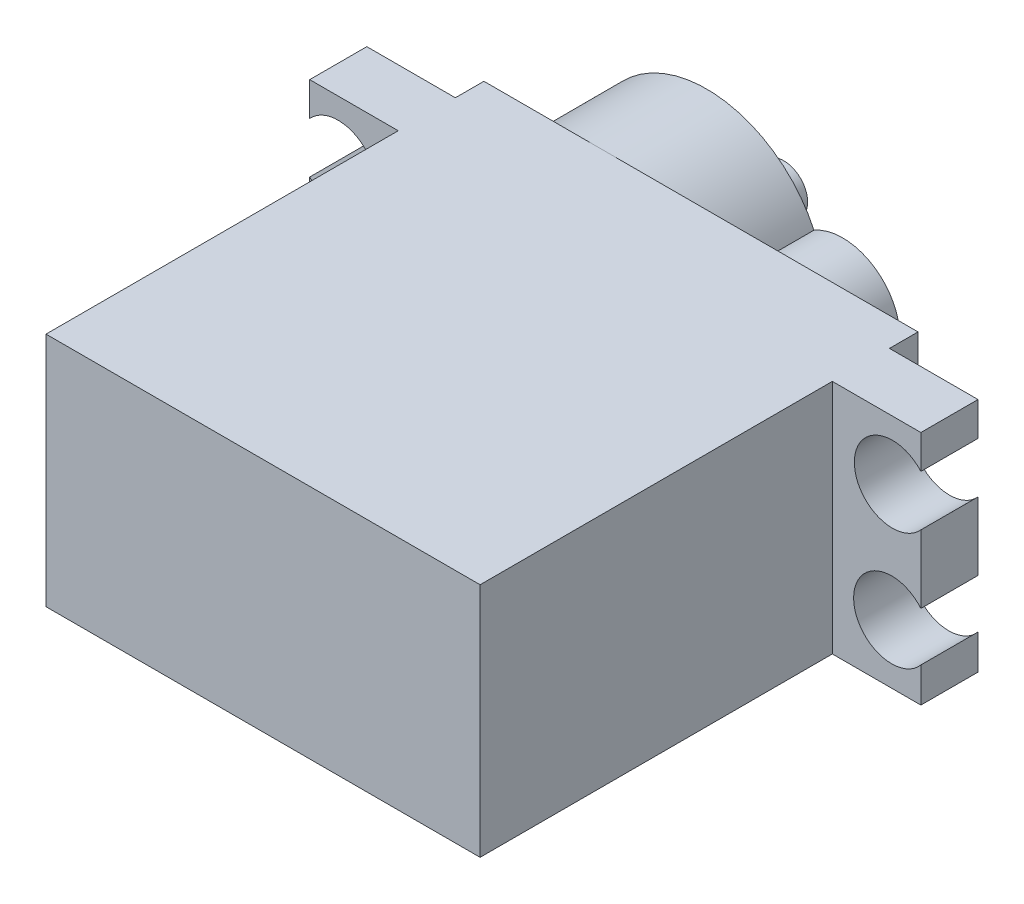
ISO-10303-21;
HEADER;
FILE_DESCRIPTION(('STEP AP214'),'2;1');
FILE_NAME('part.step','',(''),(''),'','','');
FILE_SCHEMA(('AUTOMOTIVE_DESIGN { 1 0 10303 214 1 1 1 1 }'));
ENDSEC;
DATA;
#1=APPLICATION_CONTEXT('core data for automotive mechanical design processes');
#2=APPLICATION_PROTOCOL_DEFINITION('international standard','automotive_design',2000,#1);
#3=PRODUCT_CONTEXT('',#1,'mechanical');
#4=PRODUCT('Part','Part','',(#3));
#5=PRODUCT_RELATED_PRODUCT_CATEGORY('part','',(#4));
#6=PRODUCT_DEFINITION_FORMATION('','',#4);
#7=PRODUCT_DEFINITION_CONTEXT('part definition',#1,'design');
#8=PRODUCT_DEFINITION('design','',#6,#7);
#9=PRODUCT_DEFINITION_SHAPE('','',#8);
#10=(LENGTH_UNIT() NAMED_UNIT(*) SI_UNIT(.MILLI.,.METRE.));
#11=(NAMED_UNIT(*) PLANE_ANGLE_UNIT() SI_UNIT($,.RADIAN.));
#12=(NAMED_UNIT(*) SI_UNIT($,.STERADIAN.) SOLID_ANGLE_UNIT());
#13=UNCERTAINTY_MEASURE_WITH_UNIT(LENGTH_MEASURE(1.E-05),#10,'distance_accuracy_value','');
#14=(GEOMETRIC_REPRESENTATION_CONTEXT(3) GLOBAL_UNCERTAINTY_ASSIGNED_CONTEXT((#13)) GLOBAL_UNIT_ASSIGNED_CONTEXT((#10,
#11,#12)) REPRESENTATION_CONTEXT('',''));
#15=CARTESIAN_POINT('',(0.,0.,0.));
#16=DIRECTION('',(0.,0.,1.));
#17=DIRECTION('',(1.,0.,0.));
#18=AXIS2_PLACEMENT_3D('',#15,#16,#17);
#19=CARTESIAN_POINT('',(0.,0.,-2.5));
#20=DIRECTION('',(-1.,0.,0.));
#21=DIRECTION('',(0.,0.,1.));
#22=AXIS2_PLACEMENT_3D('',#19,#20,#21);
#23=PLANE('',#22);
#24=DIRECTION('',(0.,-1.,0.));
#25=VECTOR('',#24,1.);
#26=CARTESIAN_POINT('',(0.,0.,-3.));
#27=LINE('',#26,#25);
#28=CARTESIAN_POINT('',(0.,7.97069275906132,-3.));
#29=VERTEX_POINT('',#28);
#30=CARTESIAN_POINT('',(0.,4.42930724093868,-3.));
#31=VERTEX_POINT('',#30);
#32=EDGE_CURVE('E215',#29,#31,#27,.T.);
#33=ORIENTED_EDGE('',*,*,#32,.T.);
#34=DIRECTION('',(0.,0.,-1.));
#35=VECTOR('',#34,1.);
#36=CARTESIAN_POINT('',(0.,4.42930724093868,18.501));
#37=LINE('',#36,#35);
#38=CARTESIAN_POINT('',(0.,4.42930724093868,0.));
#39=VERTEX_POINT('',#38);
#40=EDGE_CURVE('E60',#39,#31,#37,.T.);
#41=ORIENTED_EDGE('',*,*,#40,.F.);
#42=DIRECTION('',(0.,-1.,0.));
#43=VECTOR('',#42,1.);
#44=CARTESIAN_POINT('',(0.,0.,0.));
#45=LINE('',#44,#43);
#46=CARTESIAN_POINT('',(0.,7.97069275906132,0.));
#47=VERTEX_POINT('',#46);
#48=EDGE_CURVE('E217',#47,#39,#45,.T.);
#49=ORIENTED_EDGE('',*,*,#48,.F.);
#50=DIRECTION('',(0.,0.,-1.));
#51=VECTOR('',#50,1.);
#52=CARTESIAN_POINT('',(0.,7.97069275906132,18.501));
#53=LINE('',#52,#51);
#54=EDGE_CURVE('E203',#47,#29,#53,.T.);
#55=ORIENTED_EDGE('',*,*,#54,.T.);
#56=EDGE_LOOP('',(#33,#41,#49,#55));
#57=FACE_BOUND('',#56,.T.);
#58=ADVANCED_FACE('F41',(#57),#23,.T.);
#59=CARTESIAN_POINT('',(0.,1.77069275906132,0.));
#60=VERTEX_POINT('',#59);
#61=CARTESIAN_POINT('',(0.,0.,0.));
#62=VERTEX_POINT('',#61);
#63=EDGE_CURVE('E245',#60,#62,#45,.T.);
#64=ORIENTED_EDGE('',*,*,#63,.F.);
#65=DIRECTION('',(0.,0.,-1.));
#66=VECTOR('',#65,1.);
#67=CARTESIAN_POINT('',(0.,1.77069275906132,18.501));
#68=LINE('',#67,#66);
#69=CARTESIAN_POINT('',(0.,1.77069275906132,-3.));
#70=VERTEX_POINT('',#69);
#71=EDGE_CURVE('E459',#60,#70,#68,.T.);
#72=ORIENTED_EDGE('',*,*,#71,.T.);
#73=CARTESIAN_POINT('',(0.,0.,-3.));
#74=VERTEX_POINT('',#73);
#75=EDGE_CURVE('E226',#70,#74,#27,.T.);
#76=ORIENTED_EDGE('',*,*,#75,.T.);
#77=DIRECTION('',(0.,0.,1.));
#78=VECTOR('',#77,1.);
#79=CARTESIAN_POINT('',(0.,0.,-2.5));
#80=LINE('',#79,#78);
#81=EDGE_CURVE('E255',#74,#62,#80,.T.);
#82=ORIENTED_EDGE('',*,*,#81,.T.);
#83=EDGE_LOOP('',(#64,#72,#76,#82));
#84=FACE_BOUND('',#83,.T.);
#85=ADVANCED_FACE('F351',(#84),#23,.T.);
#86=DIRECTION('',(0.,0.,-1.));
#87=VECTOR('',#86,1.);
#88=CARTESIAN_POINT('',(0.,10.6293072409387,18.501));
#89=LINE('',#88,#87);
#90=CARTESIAN_POINT('',(0.,10.6293072409387,-3.));
#91=VERTEX_POINT('',#90);
#92=CARTESIAN_POINT('',(0.,10.6293072409387,0.));
#93=VERTEX_POINT('',#92);
#94=EDGE_CURVE('E68',#91,#93,#89,.F.);
#95=ORIENTED_EDGE('',*,*,#94,.T.);
#96=CARTESIAN_POINT('',(0.,12.4,0.));
#97=VERTEX_POINT('',#96);
#98=EDGE_CURVE('E246',#97,#93,#45,.T.);
#99=ORIENTED_EDGE('',*,*,#98,.F.);
#100=DIRECTION('',(0.,0.,1.));
#101=VECTOR('',#100,1.);
#102=CARTESIAN_POINT('',(0.,12.4,-2.5));
#103=LINE('',#102,#101);
#104=CARTESIAN_POINT('',(0.,12.4,-3.));
#105=VERTEX_POINT('',#104);
#106=EDGE_CURVE('E254',#105,#97,#103,.T.);
#107=ORIENTED_EDGE('',*,*,#106,.F.);
#108=EDGE_CURVE('E225',#105,#91,#27,.T.);
#109=ORIENTED_EDGE('',*,*,#108,.T.);
#110=EDGE_LOOP('',(#95,#99,#107,#109));
#111=FACE_BOUND('',#110,.T.);
#112=ADVANCED_FACE('F469',(#111),#23,.T.);
#113=CARTESIAN_POINT('',(0.,0.,0.));
#114=DIRECTION('',(0.,0.,1.));
#115=DIRECTION('',(1.,0.,0.));
#116=AXIS2_PLACEMENT_3D('',#113,#114,#115);
#117=PLANE('',#116);
#118=ORIENTED_EDGE('',*,*,#48,.T.);
#119=CARTESIAN_POINT('',(1.49430326881393,3.1,0.));
#120=DIRECTION('',(0.,0.,1.));
#121=DIRECTION('',(1.,0.,0.));
#122=AXIS2_PLACEMENT_3D('',#119,#120,#121);
#123=CIRCLE('',#122,2.);
#124=EDGE_CURVE('E348',#60,#39,#123,.T.);
#125=ORIENTED_EDGE('',*,*,#124,.F.);
#126=ORIENTED_EDGE('',*,*,#63,.T.);
#127=DIRECTION('',(1.,0.,0.));
#128=VECTOR('',#127,1.);
#129=CARTESIAN_POINT('',(0.,0.,0.));
#130=LINE('',#129,#128);
#131=CARTESIAN_POINT('',(4.65,0.,0.));
#132=VERTEX_POINT('',#131);
#133=EDGE_CURVE('E250',#62,#132,#130,.T.);
#134=ORIENTED_EDGE('',*,*,#133,.T.);
#135=DIRECTION('',(0.,-1.,0.));
#136=VECTOR('',#135,1.);
#137=CARTESIAN_POINT('',(4.65,0.,0.));
#138=LINE('',#137,#136);
#139=CARTESIAN_POINT('',(4.65,12.4,0.));
#140=VERTEX_POINT('',#139);
#141=EDGE_CURVE('E238',#140,#132,#138,.T.);
#142=ORIENTED_EDGE('',*,*,#141,.F.);
#143=DIRECTION('',(-1.,0.,0.));
#144=VECTOR('',#143,1.);
#145=CARTESIAN_POINT('',(0.,12.4,0.));
#146=LINE('',#145,#144);
#147=EDGE_CURVE('E241',#140,#97,#146,.T.);
#148=ORIENTED_EDGE('',*,*,#147,.T.);
#149=ORIENTED_EDGE('',*,*,#98,.T.);
#150=CARTESIAN_POINT('',(1.49430326881393,9.3,0.));
#151=DIRECTION('',(0.,0.,1.));
#152=DIRECTION('',(1.,0.,0.));
#153=AXIS2_PLACEMENT_3D('',#150,#151,#152);
#154=CIRCLE('',#153,2.);
#155=EDGE_CURVE('E210',#93,#47,#154,.F.);
#156=ORIENTED_EDGE('',*,*,#155,.T.);
#157=EDGE_LOOP('',(#118,#125,#126,#134,#142,#148,#149,#156));
#158=FACE_BOUND('',#157,.T.);
#159=ADVANCED_FACE('F346',(#158),#117,.T.);
#160=CARTESIAN_POINT('',(0.,0.,-3.));
#161=DIRECTION('',(0.,0.,1.));
#162=DIRECTION('',(1.,0.,0.));
#163=AXIS2_PLACEMENT_3D('',#160,#161,#162);
#164=PLANE('',#163);
#165=CARTESIAN_POINT('',(1.49430326881393,3.1,-3.));
#166=DIRECTION('',(0.,0.,-1.));
#167=DIRECTION('',(-1.,0.,0.));
#168=AXIS2_PLACEMENT_3D('',#165,#166,#167);
#169=CIRCLE('',#168,2.);
#170=EDGE_CURVE('E223',#70,#31,#169,.F.);
#171=ORIENTED_EDGE('',*,*,#170,.T.);
#172=ORIENTED_EDGE('',*,*,#32,.F.);
#173=CARTESIAN_POINT('',(1.49430326881393,9.3,-3.));
#174=DIRECTION('',(0.,0.,-1.));
#175=DIRECTION('',(-1.,0.,0.));
#176=AXIS2_PLACEMENT_3D('',#173,#174,#175);
#177=CIRCLE('',#176,2.);
#178=EDGE_CURVE('E200',#91,#29,#177,.T.);
#179=ORIENTED_EDGE('',*,*,#178,.F.);
#180=ORIENTED_EDGE('',*,*,#108,.F.);
#181=DIRECTION('',(-1.,0.,0.));
#182=VECTOR('',#181,1.);
#183=CARTESIAN_POINT('',(0.,12.4,-3.));
#184=LINE('',#183,#182);
#185=CARTESIAN_POINT('',(4.65,12.4,-3.));
#186=VERTEX_POINT('',#185);
#187=EDGE_CURVE('E231',#186,#105,#184,.T.);
#188=ORIENTED_EDGE('',*,*,#187,.F.);
#189=DIRECTION('',(0.,-1.,0.));
#190=VECTOR('',#189,1.);
#191=CARTESIAN_POINT('',(4.65,0.,-3.));
#192=LINE('',#191,#190);
#193=CARTESIAN_POINT('',(4.65,0.,-3.));
#194=VERTEX_POINT('',#193);
#195=EDGE_CURVE('E353',#186,#194,#192,.T.);
#196=ORIENTED_EDGE('',*,*,#195,.T.);
#197=DIRECTION('',(1.,0.,0.));
#198=VECTOR('',#197,1.);
#199=CARTESIAN_POINT('',(0.,0.,-3.));
#200=LINE('',#199,#198);
#201=EDGE_CURVE('E230',#74,#194,#200,.T.);
#202=ORIENTED_EDGE('',*,*,#201,.F.);
#203=ORIENTED_EDGE('',*,*,#75,.F.);
#204=EDGE_LOOP('',(#171,#172,#179,#180,#188,#196,#202,#203));
#205=FACE_BOUND('',#204,.T.);
#206=ADVANCED_FACE('F221',(#205),#164,.F.);
#207=CARTESIAN_POINT('',(32.1,0.,-2.5));
#208=DIRECTION('',(1.,0.,0.));
#209=DIRECTION('',(0.,0.,-1.));
#210=AXIS2_PLACEMENT_3D('',#207,#208,#209);
#211=PLANE('',#210);
#212=DIRECTION('',(0.,0.,-1.));
#213=VECTOR('',#212,1.);
#214=CARTESIAN_POINT('',(32.1,1.82685099618649,18.501));
#215=LINE('',#214,#213);
#216=CARTESIAN_POINT('',(32.1,1.82685099618649,-3.));
#217=VERTEX_POINT('',#216);
#218=CARTESIAN_POINT('',(32.1,1.82685099618649,0.));
#219=VERTEX_POINT('',#218);
#220=EDGE_CURVE('E444',#217,#219,#215,.F.);
#221=ORIENTED_EDGE('',*,*,#220,.T.);
#222=DIRECTION('',(0.,1.,0.));
#223=VECTOR('',#222,1.);
#224=CARTESIAN_POINT('',(32.1,0.,0.));
#225=LINE('',#224,#223);
#226=CARTESIAN_POINT('',(32.1,0.,0.));
#227=VERTEX_POINT('',#226);
#228=EDGE_CURVE('E365',#227,#219,#225,.T.);
#229=ORIENTED_EDGE('',*,*,#228,.F.);
#230=DIRECTION('',(0.,0.,1.));
#231=VECTOR('',#230,1.);
#232=CARTESIAN_POINT('',(32.1,0.,-2.5));
#233=LINE('',#232,#231);
#234=CARTESIAN_POINT('',(32.1,0.,-3.));
#235=VERTEX_POINT('',#234);
#236=EDGE_CURVE('E361',#235,#227,#233,.T.);
#237=ORIENTED_EDGE('',*,*,#236,.F.);
#238=DIRECTION('',(0.,1.,0.));
#239=VECTOR('',#238,1.);
#240=CARTESIAN_POINT('',(32.1,0.,-3.));
#241=LINE('',#240,#239);
#242=EDGE_CURVE('E383',#235,#217,#241,.T.);
#243=ORIENTED_EDGE('',*,*,#242,.T.);
#244=EDGE_LOOP('',(#221,#229,#237,#243));
#245=FACE_BOUND('',#244,.T.);
#246=ADVANCED_FACE('F547',(#245),#211,.T.);
#247=DIRECTION('',(0.,0.,-1.));
#248=VECTOR('',#247,1.);
#249=CARTESIAN_POINT('',(32.1,4.39620414096223,18.501));
#250=LINE('',#249,#248);
#251=CARTESIAN_POINT('',(32.1,4.39620414096223,0.));
#252=VERTEX_POINT('',#251);
#253=CARTESIAN_POINT('',(32.1,4.39620414096223,-3.));
#254=VERTEX_POINT('',#253);
#255=EDGE_CURVE('E440',#252,#254,#250,.T.);
#256=ORIENTED_EDGE('',*,*,#255,.T.);
#257=CARTESIAN_POINT('',(32.1,7.97069275906132,-3.));
#258=VERTEX_POINT('',#257);
#259=EDGE_CURVE('E387',#254,#258,#241,.T.);
#260=ORIENTED_EDGE('',*,*,#259,.T.);
#261=DIRECTION('',(0.,0.,-1.));
#262=VECTOR('',#261,1.);
#263=CARTESIAN_POINT('',(32.1,7.97069275906132,18.501));
#264=LINE('',#263,#262);
#265=CARTESIAN_POINT('',(32.1,7.97069275906132,0.));
#266=VERTEX_POINT('',#265);
#267=EDGE_CURVE('E424',#266,#258,#264,.T.);
#268=ORIENTED_EDGE('',*,*,#267,.F.);
#269=EDGE_CURVE('E370',#252,#266,#225,.T.);
#270=ORIENTED_EDGE('',*,*,#269,.F.);
#271=EDGE_LOOP('',(#256,#260,#268,#270));
#272=FACE_BOUND('',#271,.T.);
#273=ADVANCED_FACE('F552',(#272),#211,.T.);
#274=CARTESIAN_POINT('',(32.1,10.6293072409387,0.));
#275=VERTEX_POINT('',#274);
#276=CARTESIAN_POINT('',(32.1,12.4,0.));
#277=VERTEX_POINT('',#276);
#278=EDGE_CURVE('E371',#275,#277,#225,.T.);
#279=ORIENTED_EDGE('',*,*,#278,.F.);
#280=DIRECTION('',(0.,0.,-1.));
#281=VECTOR('',#280,1.);
#282=CARTESIAN_POINT('',(32.1,10.6293072409387,18.501));
#283=LINE('',#282,#281);
#284=CARTESIAN_POINT('',(32.1,10.6293072409387,-3.));
#285=VERTEX_POINT('',#284);
#286=EDGE_CURVE('E428',#275,#285,#283,.T.);
#287=ORIENTED_EDGE('',*,*,#286,.T.);
#288=CARTESIAN_POINT('',(32.1,12.4,-3.));
#289=VERTEX_POINT('',#288);
#290=EDGE_CURVE('E388',#285,#289,#241,.T.);
#291=ORIENTED_EDGE('',*,*,#290,.T.);
#292=DIRECTION('',(0.,0.,1.));
#293=VECTOR('',#292,1.);
#294=CARTESIAN_POINT('',(32.1,12.4,-2.5));
#295=LINE('',#294,#293);
#296=EDGE_CURVE('E357',#289,#277,#295,.T.);
#297=ORIENTED_EDGE('',*,*,#296,.T.);
#298=EDGE_LOOP('',(#279,#287,#291,#297));
#299=FACE_BOUND('',#298,.T.);
#300=ADVANCED_FACE('F554',(#299),#211,.T.);
#301=CARTESIAN_POINT('',(0.,0.,0.));
#302=DIRECTION('',(0.,0.,1.));
#303=DIRECTION('',(1.,0.,0.));
#304=AXIS2_PLACEMENT_3D('',#301,#302,#303);
#305=PLANE('',#304);
#306=CARTESIAN_POINT('',(30.5671575083011,3.11152756857436,0.));
#307=DIRECTION('',(0.,0.,1.));
#308=DIRECTION('',(1.,0.,0.));
#309=AXIS2_PLACEMENT_3D('',#306,#307,#308);
#310=CIRCLE('',#309,2.);
#311=EDGE_CURVE('E451',#219,#252,#310,.F.);
#312=ORIENTED_EDGE('',*,*,#311,.T.);
#313=ORIENTED_EDGE('',*,*,#269,.T.);
#314=CARTESIAN_POINT('',(30.6056967311861,9.3,0.));
#315=DIRECTION('',(0.,0.,1.));
#316=DIRECTION('',(1.,0.,0.));
#317=AXIS2_PLACEMENT_3D('',#314,#315,#316);
#318=CIRCLE('',#317,2.);
#319=EDGE_CURVE('E219',#275,#266,#318,.T.);
#320=ORIENTED_EDGE('',*,*,#319,.F.);
#321=ORIENTED_EDGE('',*,*,#278,.T.);
#322=DIRECTION('',(-1.,0.,0.));
#323=VECTOR('',#322,1.);
#324=CARTESIAN_POINT('',(0.,12.4,0.));
#325=LINE('',#324,#323);
#326=CARTESIAN_POINT('',(27.45,12.4,0.));
#327=VERTEX_POINT('',#326);
#328=EDGE_CURVE('E380',#277,#327,#325,.T.);
#329=ORIENTED_EDGE('',*,*,#328,.T.);
#330=DIRECTION('',(0.,-1.,0.));
#331=VECTOR('',#330,1.);
#332=CARTESIAN_POINT('',(27.45,0.,0.));
#333=LINE('',#332,#331);
#334=CARTESIAN_POINT('',(27.45,0.,0.));
#335=VERTEX_POINT('',#334);
#336=EDGE_CURVE('E376',#327,#335,#333,.T.);
#337=ORIENTED_EDGE('',*,*,#336,.T.);
#338=DIRECTION('',(1.,0.,0.));
#339=VECTOR('',#338,1.);
#340=CARTESIAN_POINT('',(0.,0.,0.));
#341=LINE('',#340,#339);
#342=EDGE_CURVE('E372',#335,#227,#341,.T.);
#343=ORIENTED_EDGE('',*,*,#342,.T.);
#344=ORIENTED_EDGE('',*,*,#228,.T.);
#345=EDGE_LOOP('',(#312,#313,#320,#321,#329,#337,#343,#344));
#346=FACE_BOUND('',#345,.T.);
#347=ADVANCED_FACE('F495',(#346),#305,.T.);
#348=CARTESIAN_POINT('',(0.,0.,-3.));
#349=DIRECTION('',(0.,0.,1.));
#350=DIRECTION('',(1.,0.,0.));
#351=AXIS2_PLACEMENT_3D('',#348,#349,#350);
#352=PLANE('',#351);
#353=ORIENTED_EDGE('',*,*,#259,.F.);
#354=CARTESIAN_POINT('',(30.5671575083011,3.11152756857436,-3.));
#355=DIRECTION('',(0.,0.,-1.));
#356=DIRECTION('',(-1.,0.,0.));
#357=AXIS2_PLACEMENT_3D('',#354,#355,#356);
#358=CIRCLE('',#357,2.);
#359=EDGE_CURVE('E448',#217,#254,#358,.T.);
#360=ORIENTED_EDGE('',*,*,#359,.F.);
#361=ORIENTED_EDGE('',*,*,#242,.F.);
#362=DIRECTION('',(1.,0.,0.));
#363=VECTOR('',#362,1.);
#364=CARTESIAN_POINT('',(0.,0.,-3.));
#365=LINE('',#364,#363);
#366=CARTESIAN_POINT('',(27.45,0.,-3.));
#367=VERTEX_POINT('',#366);
#368=EDGE_CURVE('E389',#367,#235,#365,.T.);
#369=ORIENTED_EDGE('',*,*,#368,.F.);
#370=DIRECTION('',(0.,-1.,0.));
#371=VECTOR('',#370,1.);
#372=CARTESIAN_POINT('',(27.45,0.,-3.));
#373=LINE('',#372,#371);
#374=CARTESIAN_POINT('',(27.45,12.4,-3.));
#375=VERTEX_POINT('',#374);
#376=EDGE_CURVE('E393',#375,#367,#373,.T.);
#377=ORIENTED_EDGE('',*,*,#376,.F.);
#378=DIRECTION('',(-1.,0.,0.));
#379=VECTOR('',#378,1.);
#380=CARTESIAN_POINT('',(0.,12.4,-3.));
#381=LINE('',#380,#379);
#382=EDGE_CURVE('E397',#289,#375,#381,.T.);
#383=ORIENTED_EDGE('',*,*,#382,.F.);
#384=ORIENTED_EDGE('',*,*,#290,.F.);
#385=CARTESIAN_POINT('',(30.6056967311861,9.3,-3.));
#386=DIRECTION('',(0.,0.,-1.));
#387=DIRECTION('',(-1.,0.,0.));
#388=AXIS2_PLACEMENT_3D('',#385,#386,#387);
#389=CIRCLE('',#388,2.);
#390=EDGE_CURVE('E432',#285,#258,#389,.F.);
#391=ORIENTED_EDGE('',*,*,#390,.T.);
#392=EDGE_LOOP('',(#353,#360,#361,#369,#377,#383,#384,#391));
#393=FACE_BOUND('',#392,.T.);
#394=ADVANCED_FACE('F506',(#393),#352,.F.);
#395=CARTESIAN_POINT('',(0.,0.,-4.5));
#396=DIRECTION('',(0.,0.,1.));
#397=DIRECTION('',(1.,0.,0.));
#398=AXIS2_PLACEMENT_3D('',#395,#396,#397);
#399=PLANE('',#398);
#400=CARTESIAN_POINT('',(17.9929694394184,6.2,-4.5));
#401=DIRECTION('',(0.,0.,-1.));
#402=DIRECTION('',(-1.,0.,0.));
#403=AXIS2_PLACEMENT_3D('',#400,#401,#402);
#404=CIRCLE('',#403,3.);
#405=CARTESIAN_POINT('',(16.4822523213131,8.79185913758125,-4.5));
#406=VERTEX_POINT('',#405);
#407=CARTESIAN_POINT('',(16.4822523213131,3.60814086241875,-4.5));
#408=VERTEX_POINT('',#407);
#409=EDGE_CURVE('E410',#406,#408,#404,.T.);
#410=ORIENTED_EDGE('',*,*,#409,.F.);
#411=CARTESIAN_POINT('',(10.85,6.2,-4.5));
#412=DIRECTION('',(0.,0.,-1.));
#413=DIRECTION('',(-1.,0.,0.));
#414=AXIS2_PLACEMENT_3D('',#411,#412,#413);
#415=CIRCLE('',#414,6.2);
#416=CARTESIAN_POINT('',(10.85,12.4,-4.5));
#417=VERTEX_POINT('',#416);
#418=EDGE_CURVE('E411',#417,#406,#415,.T.);
#419=ORIENTED_EDGE('',*,*,#418,.F.);
#420=DIRECTION('',(-1.,0.,0.));
#421=VECTOR('',#420,1.);
#422=CARTESIAN_POINT('',(0.,12.4,-4.5));
#423=LINE('',#422,#421);
#424=CARTESIAN_POINT('',(27.45,12.4,-4.5));
#425=VERTEX_POINT('',#424);
#426=EDGE_CURVE('E266',#425,#417,#423,.T.);
#427=ORIENTED_EDGE('',*,*,#426,.F.);
#428=DIRECTION('',(0.,-1.,0.));
#429=VECTOR('',#428,1.);
#430=CARTESIAN_POINT('',(27.45,0.,-4.5));
#431=LINE('',#430,#429);
#432=CARTESIAN_POINT('',(27.45,0.,-4.5));
#433=VERTEX_POINT('',#432);
#434=EDGE_CURVE('E259',#425,#433,#431,.T.);
#435=ORIENTED_EDGE('',*,*,#434,.T.);
#436=DIRECTION('',(1.,0.,0.));
#437=VECTOR('',#436,1.);
#438=CARTESIAN_POINT('',(0.,0.,-4.5));
#439=LINE('',#438,#437);
#440=CARTESIAN_POINT('',(10.85,0.,-4.5));
#441=VERTEX_POINT('',#440);
#442=EDGE_CURVE('E275',#441,#433,#439,.T.);
#443=ORIENTED_EDGE('',*,*,#442,.F.);
#444=EDGE_CURVE('E53',#408,#441,#415,.T.);
#445=ORIENTED_EDGE('',*,*,#444,.F.);
#446=EDGE_LOOP('',(#410,#419,#427,#435,#443,#445));
#447=FACE_BOUND('',#446,.T.);
#448=ADVANCED_FACE('F332',(#447),#399,.F.);
#449=CARTESIAN_POINT('',(4.65,6.2,-4.5));
#450=VERTEX_POINT('',#449);
#451=EDGE_CURVE('E11',#441,#450,#415,.T.);
#452=ORIENTED_EDGE('',*,*,#451,.F.);
#453=CARTESIAN_POINT('',(4.65,0.,-4.5));
#454=VERTEX_POINT('',#453);
#455=EDGE_CURVE('E276',#454,#441,#439,.T.);
#456=ORIENTED_EDGE('',*,*,#455,.F.);
#457=DIRECTION('',(0.,-1.,0.));
#458=VECTOR('',#457,1.);
#459=CARTESIAN_POINT('',(4.65,0.,-4.5));
#460=LINE('',#459,#458);
#461=EDGE_CURVE('E270',#450,#454,#460,.T.);
#462=ORIENTED_EDGE('',*,*,#461,.F.);
#463=EDGE_LOOP('',(#452,#456,#462));
#464=FACE_BOUND('',#463,.T.);
#465=ADVANCED_FACE('F325',(#464),#399,.F.);
#466=CARTESIAN_POINT('',(27.45,0.,18.5));
#467=DIRECTION('',(1.,0.,0.));
#468=DIRECTION('',(0.,0.,-1.));
#469=AXIS2_PLACEMENT_3D('',#466,#467,#468);
#470=PLANE('',#469);
#471=DIRECTION('',(0.,0.,-1.));
#472=VECTOR('',#471,1.);
#473=CARTESIAN_POINT('',(27.45,12.4,18.5));
#474=LINE('',#473,#472);
#475=EDGE_CURVE('E294',#375,#425,#474,.T.);
#476=ORIENTED_EDGE('',*,*,#475,.F.);
#477=ORIENTED_EDGE('',*,*,#376,.T.);
#478=DIRECTION('',(0.,0.,-1.));
#479=VECTOR('',#478,1.);
#480=CARTESIAN_POINT('',(27.45,0.,18.5));
#481=LINE('',#480,#479);
#482=EDGE_CURVE('E299',#367,#433,#481,.T.);
#483=ORIENTED_EDGE('',*,*,#482,.T.);
#484=ORIENTED_EDGE('',*,*,#434,.F.);
#485=EDGE_LOOP('',(#476,#477,#483,#484));
#486=FACE_BOUND('',#485,.T.);
#487=ADVANCED_FACE('F509',(#486),#470,.T.);
#488=CARTESIAN_POINT('',(4.65,0.,18.5));
#489=DIRECTION('',(1.,0.,0.));
#490=DIRECTION('',(0.,1.,0.));
#491=AXIS2_PLACEMENT_3D('',#488,#489,#490);
#492=PLANE('',#491);
#493=ORIENTED_EDGE('',*,*,#195,.F.);
#494=DIRECTION('',(0.,0.,-1.));
#495=VECTOR('',#494,1.);
#496=CARTESIAN_POINT('',(4.65,12.4,18.5));
#497=LINE('',#496,#495);
#498=CARTESIAN_POINT('',(4.65,12.4,-4.5));
#499=VERTEX_POINT('',#498);
#500=EDGE_CURVE('E307',#186,#499,#497,.T.);
#501=ORIENTED_EDGE('',*,*,#500,.T.);
#502=EDGE_CURVE('E271',#499,#450,#460,.T.);
#503=ORIENTED_EDGE('',*,*,#502,.T.);
#504=ORIENTED_EDGE('',*,*,#461,.T.);
#505=DIRECTION('',(0.,0.,-1.));
#506=VECTOR('',#505,1.);
#507=CARTESIAN_POINT('',(4.65,0.,18.5));
#508=LINE('',#507,#506);
#509=EDGE_CURVE('E303',#194,#454,#508,.T.);
#510=ORIENTED_EDGE('',*,*,#509,.F.);
#511=EDGE_LOOP('',(#493,#501,#503,#504,#510));
#512=FACE_BOUND('',#511,.T.);
#513=ADVANCED_FACE('F474',(#512),#492,.F.);
#514=CARTESIAN_POINT('',(0.,12.4,18.5));
#515=DIRECTION('',(0.,-1.,0.));
#516=DIRECTION('',(1.,0.,0.));
#517=AXIS2_PLACEMENT_3D('',#514,#515,#516);
#518=PLANE('',#517);
#519=CARTESIAN_POINT('',(27.45,12.4,18.5));
#520=VERTEX_POINT('',#519);
#521=EDGE_CURVE('E295',#520,#327,#474,.T.);
#522=ORIENTED_EDGE('',*,*,#521,.T.);
#523=ORIENTED_EDGE('',*,*,#328,.F.);
#524=ORIENTED_EDGE('',*,*,#296,.F.);
#525=ORIENTED_EDGE('',*,*,#382,.T.);
#526=ORIENTED_EDGE('',*,*,#475,.T.);
#527=ORIENTED_EDGE('',*,*,#426,.T.);
#528=EDGE_CURVE('E265',#417,#499,#423,.T.);
#529=ORIENTED_EDGE('',*,*,#528,.T.);
#530=ORIENTED_EDGE('',*,*,#500,.F.);
#531=ORIENTED_EDGE('',*,*,#187,.T.);
#532=ORIENTED_EDGE('',*,*,#106,.T.);
#533=ORIENTED_EDGE('',*,*,#147,.F.);
#534=CARTESIAN_POINT('',(4.65,12.4,18.5));
#535=VERTEX_POINT('',#534);
#536=EDGE_CURVE('E45',#535,#140,#497,.T.);
#537=ORIENTED_EDGE('',*,*,#536,.F.);
#538=DIRECTION('',(-1.,0.,0.));
#539=VECTOR('',#538,1.);
#540=CARTESIAN_POINT('',(0.,12.4,18.5));
#541=LINE('',#540,#539);
#542=EDGE_CURVE('E280',#520,#535,#541,.T.);
#543=ORIENTED_EDGE('',*,*,#542,.F.);
#544=EDGE_LOOP('',(#522,#523,#524,#525,#526,#527,#529,#530,#531,#532,#533,#537,#543));
#545=FACE_BOUND('',#544,.T.);
#546=ADVANCED_FACE('F43',(#545),#518,.F.);
#547=ORIENTED_EDGE('',*,*,#536,.T.);
#548=ORIENTED_EDGE('',*,*,#141,.T.);
#549=CARTESIAN_POINT('',(4.65,0.,18.5));
#550=VERTEX_POINT('',#549);
#551=EDGE_CURVE('E304',#550,#132,#508,.T.);
#552=ORIENTED_EDGE('',*,*,#551,.F.);
#553=DIRECTION('',(0.,-1.,0.));
#554=VECTOR('',#553,1.);
#555=CARTESIAN_POINT('',(4.65,0.,18.5));
#556=LINE('',#555,#554);
#557=EDGE_CURVE('E284',#535,#550,#556,.T.);
#558=ORIENTED_EDGE('',*,*,#557,.F.);
#559=EDGE_LOOP('',(#547,#548,#552,#558));
#560=FACE_BOUND('',#559,.T.);
#561=ADVANCED_FACE('F484',(#560),#492,.F.);
#562=CARTESIAN_POINT('',(0.,0.,18.5));
#563=DIRECTION('',(0.,1.,0.));
#564=DIRECTION('',(0.,0.,1.));
#565=AXIS2_PLACEMENT_3D('',#562,#563,#564);
#566=PLANE('',#565);
#567=ORIENTED_EDGE('',*,*,#551,.T.);
#568=ORIENTED_EDGE('',*,*,#133,.F.);
#569=ORIENTED_EDGE('',*,*,#81,.F.);
#570=ORIENTED_EDGE('',*,*,#201,.T.);
#571=ORIENTED_EDGE('',*,*,#509,.T.);
#572=ORIENTED_EDGE('',*,*,#455,.T.);
#573=ORIENTED_EDGE('',*,*,#442,.T.);
#574=ORIENTED_EDGE('',*,*,#482,.F.);
#575=ORIENTED_EDGE('',*,*,#368,.T.);
#576=ORIENTED_EDGE('',*,*,#236,.T.);
#577=ORIENTED_EDGE('',*,*,#342,.F.);
#578=CARTESIAN_POINT('',(27.45,0.,18.5));
#579=VERTEX_POINT('',#578);
#580=EDGE_CURVE('E300',#579,#335,#481,.T.);
#581=ORIENTED_EDGE('',*,*,#580,.F.);
#582=DIRECTION('',(1.,0.,0.));
#583=VECTOR('',#582,1.);
#584=CARTESIAN_POINT('',(0.,0.,18.5));
#585=LINE('',#584,#583);
#586=EDGE_CURVE('E287',#550,#579,#585,.T.);
#587=ORIENTED_EDGE('',*,*,#586,.F.);
#588=EDGE_LOOP('',(#567,#568,#569,#570,#571,#572,#573,#574,#575,#576,#577,#581,#587));
#589=FACE_BOUND('',#588,.T.);
#590=ADVANCED_FACE('F317',(#589),#566,.F.);
#591=ORIENTED_EDGE('',*,*,#336,.F.);
#592=ORIENTED_EDGE('',*,*,#521,.F.);
#593=DIRECTION('',(0.,-1.,0.));
#594=VECTOR('',#593,1.);
#595=CARTESIAN_POINT('',(27.45,0.,18.5));
#596=LINE('',#595,#594);
#597=EDGE_CURVE('E290',#520,#579,#596,.T.);
#598=ORIENTED_EDGE('',*,*,#597,.T.);
#599=ORIENTED_EDGE('',*,*,#580,.T.);
#600=EDGE_LOOP('',(#591,#592,#598,#599));
#601=FACE_BOUND('',#600,.T.);
#602=ADVANCED_FACE('F493',(#601),#470,.T.);
#603=CARTESIAN_POINT('',(0.,0.,18.5));
#604=DIRECTION('',(0.,0.,1.));
#605=DIRECTION('',(1.,0.,0.));
#606=AXIS2_PLACEMENT_3D('',#603,#604,#605);
#607=PLANE('',#606);
#608=ORIENTED_EDGE('',*,*,#542,.T.);
#609=ORIENTED_EDGE('',*,*,#557,.T.);
#610=ORIENTED_EDGE('',*,*,#586,.T.);
#611=ORIENTED_EDGE('',*,*,#597,.F.);
#612=EDGE_LOOP('',(#608,#609,#610,#611));
#613=FACE_BOUND('',#612,.T.);
#614=ADVANCED_FACE('F489',(#613),#607,.T.);
#615=EDGE_CURVE('E51',#450,#417,#415,.T.);
#616=ORIENTED_EDGE('',*,*,#615,.F.);
#617=ORIENTED_EDGE('',*,*,#502,.F.);
#618=ORIENTED_EDGE('',*,*,#528,.F.);
#619=EDGE_LOOP('',(#616,#617,#618));
#620=FACE_BOUND('',#619,.T.);
#621=ADVANCED_FACE('F476',(#620),#399,.F.);
#622=CARTESIAN_POINT('',(17.9929694394184,6.2,-10.));
#623=DIRECTION('',(0.,0.,1.));
#624=DIRECTION('',(1.,0.,0.));
#625=AXIS2_PLACEMENT_3D('',#622,#623,#624);
#626=CYLINDRICAL_SURFACE('',#625,3.);
#627=DIRECTION('',(0.,0.,1.));
#628=VECTOR('',#627,1.);
#629=CARTESIAN_POINT('',(16.4822523213131,8.79185913758125,-10.));
#630=LINE('',#629,#628);
#631=CARTESIAN_POINT('',(16.4822523213131,8.79185913758125,-10.));
#632=VERTEX_POINT('',#631);
#633=EDGE_CURVE('E404',#632,#406,#630,.T.);
#634=ORIENTED_EDGE('',*,*,#633,.T.);
#635=ORIENTED_EDGE('',*,*,#409,.T.);
#636=DIRECTION('',(0.,0.,1.));
#637=VECTOR('',#636,1.);
#638=CARTESIAN_POINT('',(16.4822523213131,3.60814086241875,-10.));
#639=LINE('',#638,#637);
#640=CARTESIAN_POINT('',(16.4822523213131,3.60814086241875,-10.));
#641=VERTEX_POINT('',#640);
#642=EDGE_CURVE('E401',#641,#408,#639,.T.);
#643=ORIENTED_EDGE('',*,*,#642,.F.);
#644=CARTESIAN_POINT('',(17.9929694394184,6.2,-10.));
#645=DIRECTION('',(0.,0.,-1.));
#646=DIRECTION('',(-1.,0.,0.));
#647=AXIS2_PLACEMENT_3D('',#644,#645,#646);
#648=CIRCLE('',#647,3.);
#649=EDGE_CURVE('E409',#632,#641,#648,.T.);
#650=ORIENTED_EDGE('',*,*,#649,.F.);
#651=EDGE_LOOP('',(#634,#635,#643,#650));
#652=FACE_BOUND('',#651,.T.);
#653=ADVANCED_FACE('F514',(#652),#626,.T.);
#654=CARTESIAN_POINT('',(10.85,6.2,-10.));
#655=DIRECTION('',(0.,0.,1.));
#656=DIRECTION('',(1.,0.,0.));
#657=AXIS2_PLACEMENT_3D('',#654,#655,#656);
#658=CYLINDRICAL_SURFACE('',#657,6.2);
#659=ORIENTED_EDGE('',*,*,#642,.T.);
#660=ORIENTED_EDGE('',*,*,#444,.T.);
#661=ORIENTED_EDGE('',*,*,#451,.T.);
#662=ORIENTED_EDGE('',*,*,#615,.T.);
#663=ORIENTED_EDGE('',*,*,#418,.T.);
#664=ORIENTED_EDGE('',*,*,#633,.F.);
#665=CARTESIAN_POINT('',(10.85,6.2,-10.));
#666=DIRECTION('',(0.,0.,-1.));
#667=DIRECTION('',(-1.,0.,0.));
#668=AXIS2_PLACEMENT_3D('',#665,#666,#667);
#669=CIRCLE('',#668,6.2);
#670=EDGE_CURVE('E406',#641,#632,#669,.T.);
#671=ORIENTED_EDGE('',*,*,#670,.F.);
#672=EDGE_LOOP('',(#659,#660,#661,#662,#663,#664,#671));
#673=FACE_BOUND('',#672,.T.);
#674=ADVANCED_FACE('F516',(#673),#658,.T.);
#675=CARTESIAN_POINT('',(14.4214847197092,6.2,-10.));
#676=DIRECTION('',(0.,0.,-1.));
#677=DIRECTION('',(-1.,0.,0.));
#678=AXIS2_PLACEMENT_3D('',#675,#676,#677);
#679=PLANE('',#678);
#680=CARTESIAN_POINT('',(10.9028353446985,5.91025894324471,-10.));
#681=DIRECTION('',(0.,0.,-1.));
#682=DIRECTION('',(-1.,0.,0.));
#683=AXIS2_PLACEMENT_3D('',#680,#681,#682);
#684=CIRCLE('',#683,1.25);
#685=CARTESIAN_POINT('',(9.6528353446985,5.91025894324471,-10.));
#686=VERTEX_POINT('',#685);
#687=EDGE_CURVE('E420',#686,#686,#684,.T.);
#688=ORIENTED_EDGE('',*,*,#687,.F.);
#689=EDGE_LOOP('',(#688));
#690=FACE_BOUND('',#689,.T.);
#691=ORIENTED_EDGE('',*,*,#649,.T.);
#692=ORIENTED_EDGE('',*,*,#670,.T.);
#693=EDGE_LOOP('',(#691,#692));
#694=FACE_BOUND('',#693,.T.);
#695=ADVANCED_FACE('F518',(#690,#694),#679,.T.);
#696=CARTESIAN_POINT('',(10.9028353446985,5.91025894324471,-14.));
#697=DIRECTION('',(0.,0.,1.));
#698=DIRECTION('',(1.,0.,0.));
#699=AXIS2_PLACEMENT_3D('',#696,#697,#698);
#700=CYLINDRICAL_SURFACE('',#699,1.25);
#701=CARTESIAN_POINT('',(10.9028353446985,5.91025894324471,-14.));
#702=DIRECTION('',(0.,0.,-1.));
#703=DIRECTION('',(-1.,0.,0.));
#704=AXIS2_PLACEMENT_3D('',#701,#702,#703);
#705=CIRCLE('',#704,1.25);
#706=CARTESIAN_POINT('',(9.6528353446985,5.91025894324471,-14.));
#707=VERTEX_POINT('',#706);
#708=EDGE_CURVE('E414',#707,#707,#705,.T.);
#709=ORIENTED_EDGE('',*,*,#708,.F.);
#710=EDGE_LOOP('',(#709));
#711=FACE_BOUND('',#710,.T.);
#712=ORIENTED_EDGE('',*,*,#687,.T.);
#713=EDGE_LOOP('',(#712));
#714=FACE_BOUND('',#713,.T.);
#715=ADVANCED_FACE('F520',(#711,#714),#700,.T.);
#716=CARTESIAN_POINT('',(10.9028353446985,5.91025894324471,-14.));
#717=DIRECTION('',(0.,0.,-1.));
#718=DIRECTION('',(-1.,0.,0.));
#719=AXIS2_PLACEMENT_3D('',#716,#717,#718);
#720=PLANE('',#719);
#721=ORIENTED_EDGE('',*,*,#708,.T.);
#722=EDGE_LOOP('',(#721));
#723=FACE_BOUND('',#722,.T.);
#724=ADVANCED_FACE('F527',(#723),#720,.T.);
#725=CARTESIAN_POINT('',(30.6056967311861,9.3,18.501));
#726=DIRECTION('',(0.,0.,-1.));
#727=DIRECTION('',(-1.,0.,0.));
#728=AXIS2_PLACEMENT_3D('',#725,#726,#727);
#729=CYLINDRICAL_SURFACE('',#728,2.);
#730=ORIENTED_EDGE('',*,*,#319,.T.);
#731=ORIENTED_EDGE('',*,*,#267,.T.);
#732=ORIENTED_EDGE('',*,*,#390,.F.);
#733=ORIENTED_EDGE('',*,*,#286,.F.);
#734=EDGE_LOOP('',(#730,#731,#732,#733));
#735=FACE_BOUND('',#734,.T.);
#736=ADVANCED_FACE('F709',(#735),#729,.F.);
#737=CARTESIAN_POINT('',(30.5671575083011,3.11152756857436,18.501));
#738=DIRECTION('',(0.,0.,-1.));
#739=DIRECTION('',(-1.,0.,0.));
#740=AXIS2_PLACEMENT_3D('',#737,#738,#739);
#741=CYLINDRICAL_SURFACE('',#740,2.);
#742=ORIENTED_EDGE('',*,*,#359,.T.);
#743=ORIENTED_EDGE('',*,*,#255,.F.);
#744=ORIENTED_EDGE('',*,*,#311,.F.);
#745=ORIENTED_EDGE('',*,*,#220,.F.);
#746=EDGE_LOOP('',(#742,#743,#744,#745));
#747=FACE_BOUND('',#746,.T.);
#748=ADVANCED_FACE('F784',(#747),#741,.F.);
#749=CARTESIAN_POINT('',(1.49430326881393,9.3,18.501));
#750=DIRECTION('',(0.,0.,-1.));
#751=DIRECTION('',(-1.,0.,0.));
#752=AXIS2_PLACEMENT_3D('',#749,#750,#751);
#753=CYLINDRICAL_SURFACE('',#752,2.);
#754=ORIENTED_EDGE('',*,*,#178,.T.);
#755=ORIENTED_EDGE('',*,*,#54,.F.);
#756=ORIENTED_EDGE('',*,*,#155,.F.);
#757=ORIENTED_EDGE('',*,*,#94,.F.);
#758=EDGE_LOOP('',(#754,#755,#756,#757));
#759=FACE_BOUND('',#758,.T.);
#760=ADVANCED_FACE('F202',(#759),#753,.F.);
#761=CARTESIAN_POINT('',(1.49430326881393,3.1,18.501));
#762=DIRECTION('',(0.,0.,-1.));
#763=DIRECTION('',(-1.,0.,0.));
#764=AXIS2_PLACEMENT_3D('',#761,#762,#763);
#765=CYLINDRICAL_SURFACE('',#764,2.);
#766=ORIENTED_EDGE('',*,*,#124,.T.);
#767=ORIENTED_EDGE('',*,*,#40,.T.);
#768=ORIENTED_EDGE('',*,*,#170,.F.);
#769=ORIENTED_EDGE('',*,*,#71,.F.);
#770=EDGE_LOOP('',(#766,#767,#768,#769));
#771=FACE_BOUND('',#770,.T.);
#772=ADVANCED_FACE('F799',(#771),#765,.F.);
#773=CLOSED_SHELL('',(#58,#85,#112,#159,#206,#246,#273,#300,#347,#394,#448,#465,#487,#513,#546,
#561,#590,#602,#614,#621,#653,#674,#695,#715,#724,#736,#748,#760,#772));
#774=MANIFOLD_SOLID_BREP('B2',#773);
#775=ADVANCED_BREP_SHAPE_REPRESENTATION('',(#18,#774),#14);
#776=SHAPE_DEFINITION_REPRESENTATION(#9,#775);
ENDSEC;
END-ISO-10303-21;
